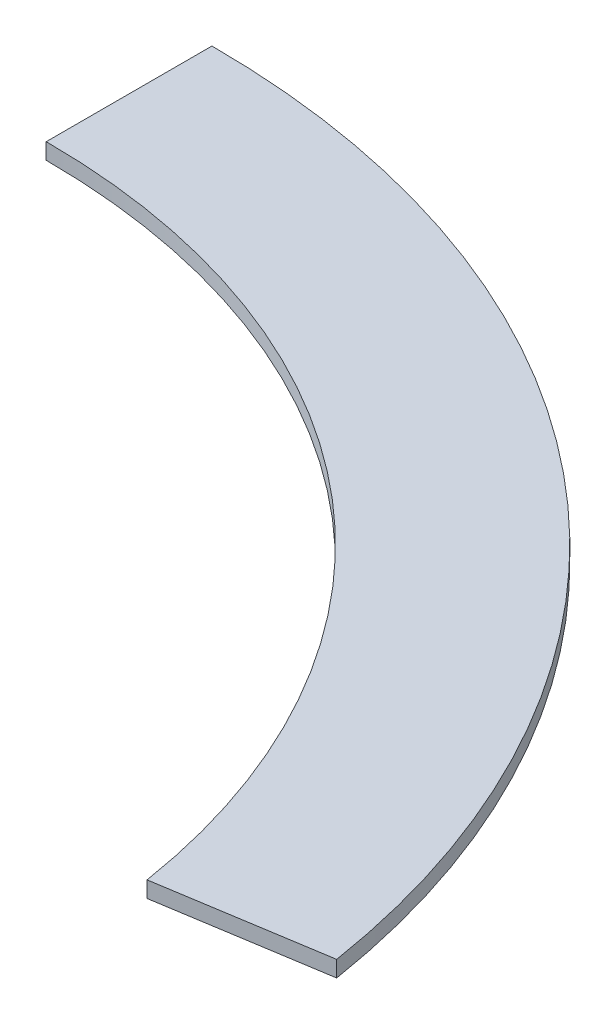
ISO-10303-21;
HEADER;
FILE_DESCRIPTION(('STEP AP214'),'2;1');
FILE_NAME('part.step','',(''),(''),'','','');
FILE_SCHEMA(('AUTOMOTIVE_DESIGN { 1 0 10303 214 1 1 1 1 }'));
ENDSEC;
DATA;
#1=APPLICATION_CONTEXT('core data for automotive mechanical design processes');
#2=APPLICATION_PROTOCOL_DEFINITION('international standard','automotive_design',2000,#1);
#3=PRODUCT_CONTEXT('',#1,'mechanical');
#4=PRODUCT('Part','Part','',(#3));
#5=PRODUCT_RELATED_PRODUCT_CATEGORY('part','',(#4));
#6=PRODUCT_DEFINITION_FORMATION('','',#4);
#7=PRODUCT_DEFINITION_CONTEXT('part definition',#1,'design');
#8=PRODUCT_DEFINITION('design','',#6,#7);
#9=PRODUCT_DEFINITION_SHAPE('','',#8);
#10=(LENGTH_UNIT() NAMED_UNIT(*) SI_UNIT(.MILLI.,.METRE.));
#11=(NAMED_UNIT(*) PLANE_ANGLE_UNIT() SI_UNIT($,.RADIAN.));
#12=(NAMED_UNIT(*) SI_UNIT($,.STERADIAN.) SOLID_ANGLE_UNIT());
#13=UNCERTAINTY_MEASURE_WITH_UNIT(LENGTH_MEASURE(1.E-05),#10,'distance_accuracy_value','');
#14=(GEOMETRIC_REPRESENTATION_CONTEXT(3) GLOBAL_UNCERTAINTY_ASSIGNED_CONTEXT((#13)) GLOBAL_UNIT_ASSIGNED_CONTEXT((#10,
#11,#12)) REPRESENTATION_CONTEXT('',''));
#15=CARTESIAN_POINT('',(0.,0.,0.));
#16=DIRECTION('',(0.,0.,1.));
#17=DIRECTION('',(1.,0.,0.));
#18=AXIS2_PLACEMENT_3D('',#15,#16,#17);
#19=CARTESIAN_POINT('',(42.7173271173915,1.,-6.77974701438883));
#20=DIRECTION('',(-0.156697036150893,0.,-0.987646717638208));
#21=DIRECTION('',(-0.987646717638208,0.,0.156697036150893));
#22=AXIS2_PLACEMENT_3D('',#19,#20,#21);
#23=PLANE('',#22);
#24=DIRECTION('',(0.,1.,0.));
#25=VECTOR('',#24,1.);
#26=CARTESIAN_POINT('',(52.8535859627471,0.,-8.38793513505986));
#27=LINE('',#26,#25);
#28=CARTESIAN_POINT('',(52.8535859627471,0.,-8.38793513505986));
#29=VERTEX_POINT('',#28);
#30=CARTESIAN_POINT('',(52.8535859627471,1.,-8.38793513505986));
#31=VERTEX_POINT('',#30);
#32=EDGE_CURVE('E57',#29,#31,#27,.T.);
#33=ORIENTED_EDGE('',*,*,#32,.T.);
#34=DIRECTION('',(0.987646717638208,0.,-0.156697036150893));
#35=VECTOR('',#34,1.);
#36=CARTESIAN_POINT('',(42.7173271173915,1.,-6.77974701438883));
#37=LINE('',#36,#35);
#38=CARTESIAN_POINT('',(42.7173271173915,1.,-6.77974701438883));
#39=VERTEX_POINT('',#38);
#40=EDGE_CURVE('E109',#39,#31,#37,.T.);
#41=ORIENTED_EDGE('',*,*,#40,.F.);
#42=DIRECTION('',(0.,-1.,0.));
#43=VECTOR('',#42,1.);
#44=CARTESIAN_POINT('',(42.7173271173915,1.,-6.77974701438883));
#45=LINE('',#44,#43);
#46=CARTESIAN_POINT('',(42.7173271173915,0.,-6.77974701438883));
#47=VERTEX_POINT('',#46);
#48=EDGE_CURVE('E11',#39,#47,#45,.T.);
#49=ORIENTED_EDGE('',*,*,#48,.T.);
#50=DIRECTION('',(0.987646717638208,0.,-0.156697036150893));
#51=VECTOR('',#50,1.);
#52=CARTESIAN_POINT('',(42.7173271173915,0.,-6.77974701438883));
#53=LINE('',#52,#51);
#54=EDGE_CURVE('E90',#47,#29,#53,.T.);
#55=ORIENTED_EDGE('',*,*,#54,.T.);
#56=EDGE_LOOP('',(#33,#41,#49,#55));
#57=FACE_BOUND('',#56,.T.);
#58=ADVANCED_FACE('F41',(#57),#23,.F.);
#59=CARTESIAN_POINT('',(0.,1.,-43.2519942388018));
#60=DIRECTION('',(1.,0.,0.));
#61=DIRECTION('',(0.,0.,-1.));
#62=AXIS2_PLACEMENT_3D('',#59,#60,#61);
#63=PLANE('',#62);
#64=DIRECTION('',(0.,1.,0.));
#65=VECTOR('',#64,1.);
#66=CARTESIAN_POINT('',(0.,0.,-53.5150353167357));
#67=LINE('',#66,#65);
#68=CARTESIAN_POINT('',(0.,0.,-53.5150353167357));
#69=VERTEX_POINT('',#68);
#70=CARTESIAN_POINT('',(0.,1.,-53.5150353167357));
#71=VERTEX_POINT('',#70);
#72=EDGE_CURVE('E85',#69,#71,#67,.T.);
#73=ORIENTED_EDGE('',*,*,#72,.F.);
#74=DIRECTION('',(0.,0.,1.));
#75=VECTOR('',#74,1.);
#76=CARTESIAN_POINT('',(0.,0.,-43.2519942388018));
#77=LINE('',#76,#75);
#78=CARTESIAN_POINT('',(0.,0.,-43.2519942388018));
#79=VERTEX_POINT('',#78);
#80=EDGE_CURVE('E80',#69,#79,#77,.T.);
#81=ORIENTED_EDGE('',*,*,#80,.T.);
#82=DIRECTION('',(0.,-1.,0.));
#83=VECTOR('',#82,1.);
#84=CARTESIAN_POINT('',(0.,1.,-43.2519942388018));
#85=LINE('',#84,#83);
#86=CARTESIAN_POINT('',(0.,1.,-43.2519942388018));
#87=VERTEX_POINT('',#86);
#88=EDGE_CURVE('E50',#87,#79,#85,.T.);
#89=ORIENTED_EDGE('',*,*,#88,.F.);
#90=DIRECTION('',(0.,0.,1.));
#91=VECTOR('',#90,1.);
#92=CARTESIAN_POINT('',(0.,1.,-43.2519942388018));
#93=LINE('',#92,#91);
#94=EDGE_CURVE('E66',#71,#87,#93,.T.);
#95=ORIENTED_EDGE('',*,*,#94,.F.);
#96=EDGE_LOOP('',(#73,#81,#89,#95));
#97=FACE_BOUND('',#96,.T.);
#98=ADVANCED_FACE('F82',(#97),#63,.F.);
#99=CARTESIAN_POINT('',(0.,1.,0.));
#100=DIRECTION('',(0.,-1.,0.));
#101=DIRECTION('',(0.,0.,-1.));
#102=AXIS2_PLACEMENT_3D('',#99,#100,#101);
#103=PLANE('',#102);
#104=CARTESIAN_POINT('',(0.,1.,0.));
#105=DIRECTION('',(0.,1.,0.));
#106=DIRECTION('',(0.,0.,1.));
#107=AXIS2_PLACEMENT_3D('',#104,#105,#106);
#108=CIRCLE('',#107,53.5150353167357);
#109=EDGE_CURVE('E118',#31,#71,#108,.T.);
#110=ORIENTED_EDGE('',*,*,#109,.T.);
#111=ORIENTED_EDGE('',*,*,#94,.T.);
#112=CARTESIAN_POINT('',(0.,1.,0.));
#113=DIRECTION('',(0.,-1.,0.));
#114=DIRECTION('',(0.,0.,-1.));
#115=AXIS2_PLACEMENT_3D('',#112,#113,#114);
#116=CIRCLE('',#115,43.2519942388018);
#117=EDGE_CURVE('E89',#87,#39,#116,.T.);
#118=ORIENTED_EDGE('',*,*,#117,.T.);
#119=ORIENTED_EDGE('',*,*,#40,.T.);
#120=EDGE_LOOP('',(#110,#111,#118,#119));
#121=FACE_BOUND('',#120,.T.);
#122=ADVANCED_FACE('F126',(#121),#103,.F.);
#123=CARTESIAN_POINT('',(0.,0.,0.));
#124=DIRECTION('',(0.,-1.,0.));
#125=DIRECTION('',(0.,0.,-1.));
#126=AXIS2_PLACEMENT_3D('',#123,#124,#125);
#127=PLANE('',#126);
#128=ORIENTED_EDGE('',*,*,#80,.F.);
#129=CARTESIAN_POINT('',(0.,0.,0.));
#130=DIRECTION('',(0.,1.,0.));
#131=DIRECTION('',(0.,0.,1.));
#132=AXIS2_PLACEMENT_3D('',#129,#130,#131);
#133=CIRCLE('',#132,53.5150353167357);
#134=EDGE_CURVE('E116',#29,#69,#133,.T.);
#135=ORIENTED_EDGE('',*,*,#134,.F.);
#136=ORIENTED_EDGE('',*,*,#54,.F.);
#137=CARTESIAN_POINT('',(0.,0.,0.));
#138=DIRECTION('',(0.,-1.,0.));
#139=DIRECTION('',(0.,0.,-1.));
#140=AXIS2_PLACEMENT_3D('',#137,#138,#139);
#141=CIRCLE('',#140,43.2519942388018);
#142=EDGE_CURVE('E95',#79,#47,#141,.T.);
#143=ORIENTED_EDGE('',*,*,#142,.F.);
#144=EDGE_LOOP('',(#128,#135,#136,#143));
#145=FACE_BOUND('',#144,.T.);
#146=ADVANCED_FACE('F97',(#145),#127,.T.);
#147=CARTESIAN_POINT('',(0.,1.,0.));
#148=DIRECTION('',(0.,-1.,0.));
#149=DIRECTION('',(0.,0.,-1.));
#150=AXIS2_PLACEMENT_3D('',#147,#148,#149);
#151=CYLINDRICAL_SURFACE('',#150,43.2519942388018);
#152=ORIENTED_EDGE('',*,*,#142,.T.);
#153=ORIENTED_EDGE('',*,*,#48,.F.);
#154=ORIENTED_EDGE('',*,*,#117,.F.);
#155=ORIENTED_EDGE('',*,*,#88,.T.);
#156=EDGE_LOOP('',(#152,#153,#154,#155));
#157=FACE_BOUND('',#156,.T.);
#158=ADVANCED_FACE('F43',(#157),#151,.F.);
#159=CARTESIAN_POINT('',(0.,0.,0.));
#160=DIRECTION('',(0.,1.,0.));
#161=DIRECTION('',(0.,0.,1.));
#162=AXIS2_PLACEMENT_3D('',#159,#160,#161);
#163=CYLINDRICAL_SURFACE('',#162,53.5150353167357);
#164=ORIENTED_EDGE('',*,*,#109,.F.);
#165=ORIENTED_EDGE('',*,*,#32,.F.);
#166=ORIENTED_EDGE('',*,*,#134,.T.);
#167=ORIENTED_EDGE('',*,*,#72,.T.);
#168=EDGE_LOOP('',(#164,#165,#166,#167));
#169=FACE_BOUND('',#168,.T.);
#170=ADVANCED_FACE('F121',(#169),#163,.T.);
#171=CLOSED_SHELL('',(#58,#98,#122,#146,#158,#170));
#172=MANIFOLD_SOLID_BREP('B2',#171);
#173=ADVANCED_BREP_SHAPE_REPRESENTATION('',(#18,#172),#14);
#174=SHAPE_DEFINITION_REPRESENTATION(#9,#173);
ENDSEC;
END-ISO-10303-21;
